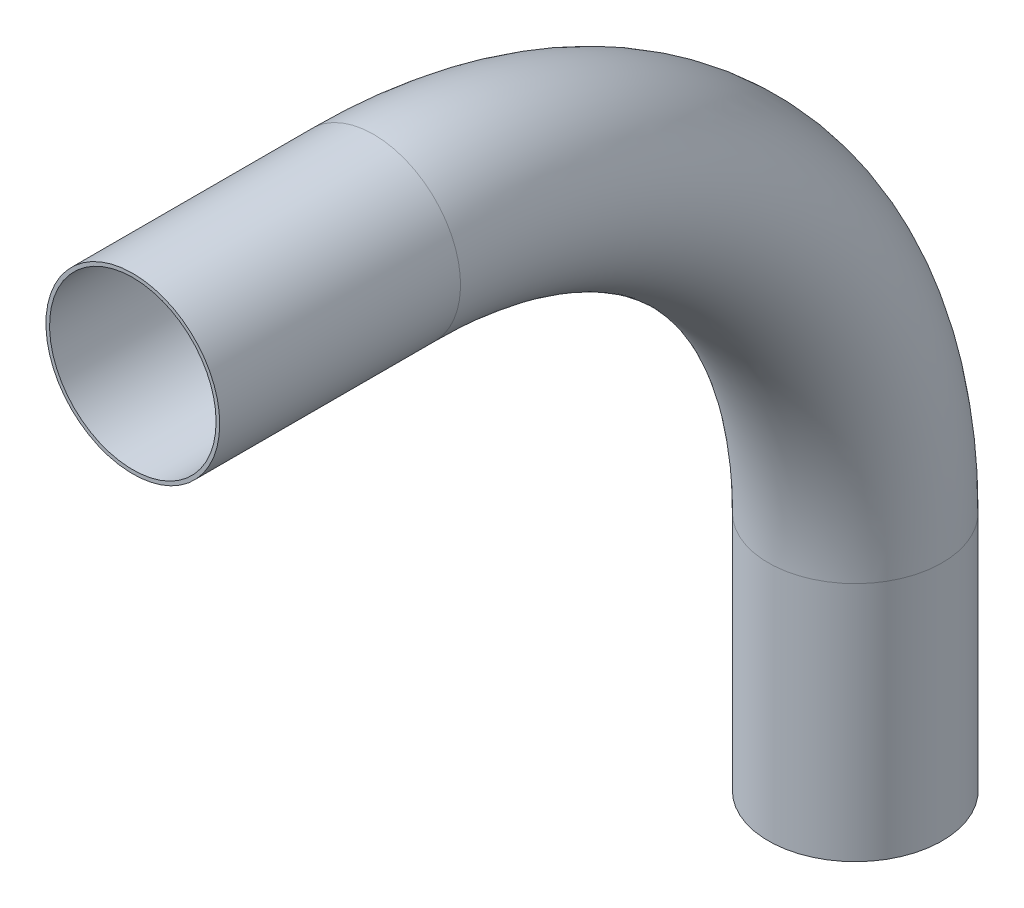
ISO-10303-21;
HEADER;
FILE_DESCRIPTION(('STEP AP214'),'2;1');
FILE_NAME('part.step','',(''),(''),'','','');
FILE_SCHEMA(('AUTOMOTIVE_DESIGN { 1 0 10303 214 1 1 1 1 }'));
ENDSEC;
DATA;
#1=APPLICATION_CONTEXT('core data for automotive mechanical design processes');
#2=APPLICATION_PROTOCOL_DEFINITION('international standard','automotive_design',2000,#1);
#3=PRODUCT_CONTEXT('',#1,'mechanical');
#4=PRODUCT('Part','Part','',(#3));
#5=PRODUCT_RELATED_PRODUCT_CATEGORY('part','',(#4));
#6=PRODUCT_DEFINITION_FORMATION('','',#4);
#7=PRODUCT_DEFINITION_CONTEXT('part definition',#1,'design');
#8=PRODUCT_DEFINITION('design','',#6,#7);
#9=PRODUCT_DEFINITION_SHAPE('','',#8);
#10=(LENGTH_UNIT() NAMED_UNIT(*) SI_UNIT(.MILLI.,.METRE.));
#11=(NAMED_UNIT(*) PLANE_ANGLE_UNIT() SI_UNIT($,.RADIAN.));
#12=(NAMED_UNIT(*) SI_UNIT($,.STERADIAN.) SOLID_ANGLE_UNIT());
#13=UNCERTAINTY_MEASURE_WITH_UNIT(LENGTH_MEASURE(1.E-05),#10,'distance_accuracy_value','');
#14=(GEOMETRIC_REPRESENTATION_CONTEXT(3) GLOBAL_UNCERTAINTY_ASSIGNED_CONTEXT((#13)) GLOBAL_UNIT_ASSIGNED_CONTEXT((#10,
#11,#12)) REPRESENTATION_CONTEXT('',''));
#15=CARTESIAN_POINT('',(0.,0.,0.));
#16=DIRECTION('',(0.,0.,1.));
#17=DIRECTION('',(1.,0.,0.));
#18=AXIS2_PLACEMENT_3D('',#15,#16,#17);
#19=CARTESIAN_POINT('',(0.,152.4,0.));
#20=DIRECTION('',(0.,-1.,0.));
#21=DIRECTION('',(0.,0.,-1.));
#22=AXIS2_PLACEMENT_3D('',#19,#20,#21);
#23=CYLINDRICAL_SURFACE('',#22,52.7);
#24=CARTESIAN_POINT('',(0.,152.4,0.));
#25=DIRECTION('',(0.,1.,0.));
#26=DIRECTION('',(0.,0.,1.));
#27=AXIS2_PLACEMENT_3D('',#24,#25,#26);
#28=CIRCLE('',#27,52.7);
#29=CARTESIAN_POINT('',(0.,152.4,-52.7));
#30=VERTEX_POINT('',#29);
#31=EDGE_CURVE('E47',#30,#30,#28,.F.);
#32=CARTESIAN_POINT('',(0.,0.,0.));
#33=DIRECTION('',(0.,1.,0.));
#34=DIRECTION('',(0.,0.,1.));
#35=AXIS2_PLACEMENT_3D('',#32,#33,#34);
#36=CIRCLE('',#35,52.7);
#37=CARTESIAN_POINT('',(0.,0.,-52.7));
#38=VERTEX_POINT('',#37);
#39=EDGE_CURVE('E42',#38,#38,#36,.T.);
#40=CARTESIAN_POINT('',(0.,152.4,-52.7));
#41=CARTESIAN_POINT('',(0.,150.8125,-52.7));
#42=CARTESIAN_POINT('',(0.,149.225,-52.7));
#43=CARTESIAN_POINT('',(0.,146.05,-52.7));
#44=CARTESIAN_POINT('',(0.,144.4625,-52.7));
#45=CARTESIAN_POINT('',(0.,141.2875,-52.7));
#46=CARTESIAN_POINT('',(0.,139.7,-52.7));
#47=CARTESIAN_POINT('',(0.,136.525,-52.7));
#48=CARTESIAN_POINT('',(0.,134.9375,-52.7));
#49=CARTESIAN_POINT('',(0.,131.7625,-52.7));
#50=CARTESIAN_POINT('',(0.,130.175,-52.7));
#51=CARTESIAN_POINT('',(0.,127.,-52.7));
#52=CARTESIAN_POINT('',(0.,125.4125,-52.7));
#53=CARTESIAN_POINT('',(0.,122.2375,-52.7));
#54=CARTESIAN_POINT('',(0.,120.65,-52.7));
#55=CARTESIAN_POINT('',(0.,117.475,-52.7));
#56=CARTESIAN_POINT('',(0.,115.8875,-52.7));
#57=CARTESIAN_POINT('',(0.,112.7125,-52.7));
#58=CARTESIAN_POINT('',(0.,111.125,-52.7));
#59=CARTESIAN_POINT('',(0.,107.95,-52.7));
#60=CARTESIAN_POINT('',(0.,106.3625,-52.7));
#61=CARTESIAN_POINT('',(0.,103.1875,-52.7));
#62=CARTESIAN_POINT('',(0.,101.6,-52.7));
#63=CARTESIAN_POINT('',(0.,98.425,-52.7));
#64=CARTESIAN_POINT('',(0.,96.8375,-52.7));
#65=CARTESIAN_POINT('',(0.,93.6625,-52.7));
#66=CARTESIAN_POINT('',(0.,92.075,-52.7));
#67=CARTESIAN_POINT('',(0.,88.9,-52.7));
#68=CARTESIAN_POINT('',(0.,87.3125,-52.7));
#69=CARTESIAN_POINT('',(0.,84.1375,-52.7));
#70=CARTESIAN_POINT('',(0.,82.55,-52.7));
#71=CARTESIAN_POINT('',(0.,79.375,-52.7));
#72=CARTESIAN_POINT('',(0.,77.7875,-52.7));
#73=CARTESIAN_POINT('',(0.,74.6125,-52.7));
#74=CARTESIAN_POINT('',(0.,73.025,-52.7));
#75=CARTESIAN_POINT('',(0.,69.85,-52.7));
#76=CARTESIAN_POINT('',(0.,68.2625,-52.7));
#77=CARTESIAN_POINT('',(0.,65.0875,-52.7));
#78=CARTESIAN_POINT('',(0.,63.5,-52.7));
#79=CARTESIAN_POINT('',(0.,60.325,-52.7));
#80=CARTESIAN_POINT('',(0.,58.7375,-52.7));
#81=CARTESIAN_POINT('',(0.,55.5625,-52.7));
#82=CARTESIAN_POINT('',(0.,53.975,-52.7));
#83=CARTESIAN_POINT('',(0.,50.8,-52.7));
#84=CARTESIAN_POINT('',(0.,49.2125,-52.7));
#85=CARTESIAN_POINT('',(0.,46.0375,-52.7));
#86=CARTESIAN_POINT('',(0.,44.45,-52.7));
#87=CARTESIAN_POINT('',(0.,41.275,-52.7));
#88=CARTESIAN_POINT('',(0.,39.6875,-52.7));
#89=CARTESIAN_POINT('',(0.,36.5125,-52.7));
#90=CARTESIAN_POINT('',(0.,34.925,-52.7));
#91=CARTESIAN_POINT('',(0.,31.75,-52.7));
#92=CARTESIAN_POINT('',(0.,30.1625,-52.7));
#93=CARTESIAN_POINT('',(0.,26.9875,-52.7));
#94=CARTESIAN_POINT('',(0.,25.4,-52.7));
#95=CARTESIAN_POINT('',(0.,22.225,-52.7));
#96=CARTESIAN_POINT('',(0.,20.6375,-52.7));
#97=CARTESIAN_POINT('',(0.,17.4625,-52.7));
#98=CARTESIAN_POINT('',(0.,15.875,-52.7));
#99=CARTESIAN_POINT('',(0.,12.7,-52.7));
#100=CARTESIAN_POINT('',(0.,11.1125,-52.7));
#101=CARTESIAN_POINT('',(0.,7.93750000000001,-52.7));
#102=CARTESIAN_POINT('',(0.,6.35,-52.7));
#103=CARTESIAN_POINT('',(0.,3.175,-52.7));
#104=CARTESIAN_POINT('',(0.,1.5875,-52.7));
#105=CARTESIAN_POINT('',(0.,0.,-52.7));
#106=B_SPLINE_CURVE_WITH_KNOTS('',3,(#40,#41,#42,#43,#44,#45,#46,#47,#48,#49,#50,#51,#52,#53,
#54,#55,#56,#57,#58,#59,#60,#61,#62,#63,#64,#65,#66,#67,#68,#69,#70,#71,#72,#73,#74,#75,#76,#77,
#78,#79,#80,#81,#82,#83,#84,#85,#86,#87,#88,#89,#90,#91,#92,#93,#94,#95,#96,#97,#98,#99,#100,
#101,#102,#103,#104,#105),.UNSPECIFIED.,.F.,.F.,(4,2,2,2,2,2,2,2,2,2,2,2,2,2,2,2,2,2,2,2,2,2,2,
2,2,2,2,2,2,2,2,2,4),(0.,4.76249999999998,9.52499999999998,14.2875,19.05,23.8125,28.575,33.3375,
38.1,42.8625,47.625,52.3875,57.15,61.9125,66.675,71.4375,76.2,80.9625,85.725,90.4875,95.25,
100.0125,104.775,109.5375,114.3,119.0625,123.825,128.5875,133.35,138.1125,142.875,147.6375,
152.4),.UNSPECIFIED.);
#107=EDGE_CURVE('BSEAM31',#30,#38,#106,.T.);
#108=ORIENTED_EDGE('',*,*,#31,.F.);
#109=ORIENTED_EDGE('',*,*,#39,.F.);
#110=ORIENTED_EDGE('',*,*,#107,.T.);
#111=ORIENTED_EDGE('',*,*,#107,.F.);
#112=EDGE_LOOP('',(#108,#110,#109,#111));
#113=FACE_BOUND('',#112,.T.);
#114=ADVANCED_FACE('F31',(#113),#23,.F.);
#115=CARTESIAN_POINT('',(0.,152.4,0.));
#116=DIRECTION('',(0.,-1.,0.));
#117=DIRECTION('',(0.,0.,-1.));
#118=AXIS2_PLACEMENT_3D('',#115,#116,#117);
#119=CYLINDRICAL_SURFACE('',#118,55.);
#120=CARTESIAN_POINT('',(0.,152.4,0.));
#121=DIRECTION('',(0.,1.,0.));
#122=DIRECTION('',(0.,0.,1.));
#123=AXIS2_PLACEMENT_3D('',#120,#121,#122);
#124=CIRCLE('',#123,55.);
#125=CARTESIAN_POINT('',(0.,152.4,-55.));
#126=VERTEX_POINT('',#125);
#127=EDGE_CURVE('E10',#126,#126,#124,.T.);
#128=CARTESIAN_POINT('',(0.,0.,0.));
#129=DIRECTION('',(0.,1.,0.));
#130=DIRECTION('',(0.,0.,1.));
#131=AXIS2_PLACEMENT_3D('',#128,#129,#130);
#132=CIRCLE('',#131,55.);
#133=CARTESIAN_POINT('',(0.,0.,-55.));
#134=VERTEX_POINT('',#133);
#135=EDGE_CURVE('E34',#134,#134,#132,.T.);
#136=CARTESIAN_POINT('',(0.,152.4,-55.));
#137=CARTESIAN_POINT('',(0.,150.8125,-55.));
#138=CARTESIAN_POINT('',(0.,149.225,-55.));
#139=CARTESIAN_POINT('',(0.,146.05,-55.));
#140=CARTESIAN_POINT('',(0.,144.4625,-55.));
#141=CARTESIAN_POINT('',(0.,141.2875,-55.));
#142=CARTESIAN_POINT('',(0.,139.7,-55.));
#143=CARTESIAN_POINT('',(0.,136.525,-55.));
#144=CARTESIAN_POINT('',(0.,134.9375,-55.));
#145=CARTESIAN_POINT('',(0.,131.7625,-55.));
#146=CARTESIAN_POINT('',(0.,130.175,-55.));
#147=CARTESIAN_POINT('',(0.,127.,-55.));
#148=CARTESIAN_POINT('',(0.,125.4125,-55.));
#149=CARTESIAN_POINT('',(0.,122.2375,-55.));
#150=CARTESIAN_POINT('',(0.,120.65,-55.));
#151=CARTESIAN_POINT('',(0.,117.475,-55.));
#152=CARTESIAN_POINT('',(0.,115.8875,-55.));
#153=CARTESIAN_POINT('',(0.,112.7125,-55.));
#154=CARTESIAN_POINT('',(0.,111.125,-55.));
#155=CARTESIAN_POINT('',(0.,107.95,-55.));
#156=CARTESIAN_POINT('',(0.,106.3625,-55.));
#157=CARTESIAN_POINT('',(0.,103.1875,-55.));
#158=CARTESIAN_POINT('',(0.,101.6,-55.));
#159=CARTESIAN_POINT('',(0.,98.425,-55.));
#160=CARTESIAN_POINT('',(0.,96.8375,-55.));
#161=CARTESIAN_POINT('',(0.,93.6625,-55.));
#162=CARTESIAN_POINT('',(0.,92.075,-55.));
#163=CARTESIAN_POINT('',(0.,88.9,-55.));
#164=CARTESIAN_POINT('',(0.,87.3125,-55.));
#165=CARTESIAN_POINT('',(0.,84.1375,-55.));
#166=CARTESIAN_POINT('',(0.,82.55,-55.));
#167=CARTESIAN_POINT('',(0.,79.375,-55.));
#168=CARTESIAN_POINT('',(0.,77.7875,-55.));
#169=CARTESIAN_POINT('',(0.,74.6125,-55.));
#170=CARTESIAN_POINT('',(0.,73.025,-55.));
#171=CARTESIAN_POINT('',(0.,69.85,-55.));
#172=CARTESIAN_POINT('',(0.,68.2625,-55.));
#173=CARTESIAN_POINT('',(0.,65.0875,-55.));
#174=CARTESIAN_POINT('',(0.,63.5,-55.));
#175=CARTESIAN_POINT('',(0.,60.325,-55.));
#176=CARTESIAN_POINT('',(0.,58.7375,-55.));
#177=CARTESIAN_POINT('',(0.,55.5625,-55.));
#178=CARTESIAN_POINT('',(0.,53.975,-55.));
#179=CARTESIAN_POINT('',(0.,50.8,-55.));
#180=CARTESIAN_POINT('',(0.,49.2125,-55.));
#181=CARTESIAN_POINT('',(0.,46.0375,-55.));
#182=CARTESIAN_POINT('',(0.,44.45,-55.));
#183=CARTESIAN_POINT('',(0.,41.275,-55.));
#184=CARTESIAN_POINT('',(0.,39.6875,-55.));
#185=CARTESIAN_POINT('',(0.,36.5125,-55.));
#186=CARTESIAN_POINT('',(0.,34.925,-55.));
#187=CARTESIAN_POINT('',(0.,31.75,-55.));
#188=CARTESIAN_POINT('',(0.,30.1625,-55.));
#189=CARTESIAN_POINT('',(0.,26.9875,-55.));
#190=CARTESIAN_POINT('',(0.,25.4,-55.));
#191=CARTESIAN_POINT('',(0.,22.225,-55.));
#192=CARTESIAN_POINT('',(0.,20.6375,-55.));
#193=CARTESIAN_POINT('',(0.,17.4625,-55.));
#194=CARTESIAN_POINT('',(0.,15.875,-55.));
#195=CARTESIAN_POINT('',(0.,12.7,-55.));
#196=CARTESIAN_POINT('',(0.,11.1125,-55.));
#197=CARTESIAN_POINT('',(0.,7.93750000000001,-55.));
#198=CARTESIAN_POINT('',(0.,6.35,-55.));
#199=CARTESIAN_POINT('',(0.,3.175,-55.));
#200=CARTESIAN_POINT('',(0.,1.5875,-55.));
#201=CARTESIAN_POINT('',(0.,0.,-55.));
#202=B_SPLINE_CURVE_WITH_KNOTS('',3,(#136,#137,#138,#139,#140,#141,#142,#143,#144,#145,#146,
#147,#148,#149,#150,#151,#152,#153,#154,#155,#156,#157,#158,#159,#160,#161,#162,#163,#164,#165,
#166,#167,#168,#169,#170,#171,#172,#173,#174,#175,#176,#177,#178,#179,#180,#181,#182,#183,#184,
#185,#186,#187,#188,#189,#190,#191,#192,#193,#194,#195,#196,#197,#198,#199,#200,#201),
.UNSPECIFIED.,.F.,.F.,(4,2,2,2,2,2,2,2,2,2,2,2,2,2,2,2,2,2,2,2,2,2,2,2,2,2,2,2,2,2,2,2,4),(0.,
4.76249999999998,9.52499999999998,14.2875,19.05,23.8125,28.575,33.3375,38.1,42.8625,47.625,
52.3875,57.15,61.9125,66.675,71.4375,76.2,80.9625,85.725,90.4875,95.25,100.0125,104.775,
109.5375,114.3,119.0625,123.825,128.5875,133.35,138.1125,142.875,147.6375,152.4),.UNSPECIFIED.);
#203=EDGE_CURVE('BSEAM90',#126,#134,#202,.T.);
#204=ORIENTED_EDGE('',*,*,#127,.F.);
#205=ORIENTED_EDGE('',*,*,#135,.T.);
#206=ORIENTED_EDGE('',*,*,#203,.T.);
#207=ORIENTED_EDGE('',*,*,#203,.F.);
#208=EDGE_LOOP('',(#204,#206,#205,#207));
#209=FACE_BOUND('',#208,.T.);
#210=ADVANCED_FACE('F90',(#209),#119,.T.);
#211=CARTESIAN_POINT('',(0.,0.,0.));
#212=DIRECTION('',(0.,1.,0.));
#213=DIRECTION('',(0.,0.,1.));
#214=AXIS2_PLACEMENT_3D('',#211,#212,#213);
#215=PLANE('',#214);
#216=ORIENTED_EDGE('',*,*,#39,.T.);
#217=EDGE_LOOP('',(#216));
#218=FACE_BOUND('',#217,.T.);
#219=ORIENTED_EDGE('',*,*,#135,.F.);
#220=EDGE_LOOP('',(#219));
#221=FACE_BOUND('',#220,.T.);
#222=ADVANCED_FACE('F83',(#218,#221),#215,.F.);
#223=CARTESIAN_POINT('',(0.,152.4,304.8));
#224=DIRECTION('',(-1.,0.,0.));
#225=DIRECTION('',(0.,0.,1.));
#226=AXIS2_PLACEMENT_3D('',#223,#224,#225);
#227=TOROIDAL_SURFACE('',#226,304.8,55.);
#228=CARTESIAN_POINT('',(0.,457.2,304.8));
#229=DIRECTION('',(0.,0.,1.));
#230=DIRECTION('',(0.,-1.,0.));
#231=AXIS2_PLACEMENT_3D('',#228,#229,#230);
#232=CIRCLE('',#231,55.);
#233=CARTESIAN_POINT('',(0.,512.2,304.8));
#234=VERTEX_POINT('',#233);
#235=EDGE_CURVE('E44',#234,#234,#232,.T.);
#236=CARTESIAN_POINT('',(0.,152.4,304.8));
#237=DIRECTION('',(-1.,0.,0.));
#238=DIRECTION('',(0.,0.,1.));
#239=AXIS2_PLACEMENT_3D('',#236,#237,#238);
#240=CIRCLE('',#239,359.8);
#241=EDGE_CURVE('',#234,#126,#240,.T.);
#242=ORIENTED_EDGE('',*,*,#235,.F.);
#243=ORIENTED_EDGE('',*,*,#127,.T.);
#244=ORIENTED_EDGE('',*,*,#241,.T.);
#245=ORIENTED_EDGE('',*,*,#241,.F.);
#246=EDGE_LOOP('',(#242,#244,#243,#245));
#247=FACE_BOUND('',#246,.T.);
#248=ADVANCED_FACE('F80',(#247),#227,.T.);
#249=CARTESIAN_POINT('',(0.,152.4,304.8));
#250=DIRECTION('',(-1.,0.,0.));
#251=DIRECTION('',(0.,0.,1.));
#252=AXIS2_PLACEMENT_3D('',#249,#250,#251);
#253=TOROIDAL_SURFACE('',#252,304.8,52.7);
#254=CARTESIAN_POINT('',(0.,457.2,304.8));
#255=DIRECTION('',(0.,0.,1.));
#256=DIRECTION('',(0.,-1.,0.));
#257=AXIS2_PLACEMENT_3D('',#254,#255,#256);
#258=CIRCLE('',#257,52.7);
#259=CARTESIAN_POINT('',(0.,509.9,304.8));
#260=VERTEX_POINT('',#259);
#261=EDGE_CURVE('E51',#260,#260,#258,.F.);
#262=CARTESIAN_POINT('',(0.,152.4,304.8));
#263=DIRECTION('',(-1.,0.,0.));
#264=DIRECTION('',(0.,0.,1.));
#265=AXIS2_PLACEMENT_3D('',#262,#263,#264);
#266=CIRCLE('',#265,357.5);
#267=EDGE_CURVE('',#260,#30,#266,.T.);
#268=ORIENTED_EDGE('',*,*,#261,.F.);
#269=ORIENTED_EDGE('',*,*,#31,.T.);
#270=ORIENTED_EDGE('',*,*,#267,.T.);
#271=ORIENTED_EDGE('',*,*,#267,.F.);
#272=EDGE_LOOP('',(#268,#270,#269,#271));
#273=FACE_BOUND('',#272,.T.);
#274=ADVANCED_FACE('F82',(#273),#253,.F.);
#275=CARTESIAN_POINT('',(0.,457.2,457.2));
#276=DIRECTION('',(0.,0.,-1.));
#277=DIRECTION('',(-1.,0.,0.));
#278=AXIS2_PLACEMENT_3D('',#275,#276,#277);
#279=CYLINDRICAL_SURFACE('',#278,52.7);
#280=CARTESIAN_POINT('',(0.,457.2,457.2));
#281=DIRECTION('',(0.,0.,1.));
#282=DIRECTION('',(1.,0.,0.));
#283=AXIS2_PLACEMENT_3D('',#280,#281,#282);
#284=CIRCLE('',#283,52.7);
#285=CARTESIAN_POINT('',(52.7,457.2,457.2));
#286=VERTEX_POINT('',#285);
#287=EDGE_CURVE('E60',#286,#286,#284,.T.);
#288=ORIENTED_EDGE('',*,*,#287,.T.);
#289=EDGE_LOOP('',(#288));
#290=FACE_BOUND('',#289,.T.);
#291=ORIENTED_EDGE('',*,*,#261,.T.);
#292=EDGE_LOOP('',(#291));
#293=FACE_BOUND('',#292,.T.);
#294=ADVANCED_FACE('F64',(#290,#293),#279,.F.);
#295=CARTESIAN_POINT('',(0.,457.2,457.2));
#296=DIRECTION('',(0.,0.,-1.));
#297=DIRECTION('',(-1.,0.,0.));
#298=AXIS2_PLACEMENT_3D('',#295,#296,#297);
#299=CYLINDRICAL_SURFACE('',#298,55.);
#300=CARTESIAN_POINT('',(0.,457.2,457.2));
#301=DIRECTION('',(0.,0.,1.));
#302=DIRECTION('',(1.,0.,0.));
#303=AXIS2_PLACEMENT_3D('',#300,#301,#302);
#304=CIRCLE('',#303,55.);
#305=CARTESIAN_POINT('',(55.,457.2,457.2));
#306=VERTEX_POINT('',#305);
#307=EDGE_CURVE('E57',#306,#306,#304,.T.);
#308=ORIENTED_EDGE('',*,*,#307,.F.);
#309=EDGE_LOOP('',(#308));
#310=FACE_BOUND('',#309,.T.);
#311=ORIENTED_EDGE('',*,*,#235,.T.);
#312=EDGE_LOOP('',(#311));
#313=FACE_BOUND('',#312,.T.);
#314=ADVANCED_FACE('F70',(#310,#313),#299,.T.);
#315=CARTESIAN_POINT('',(0.,0.,457.2));
#316=DIRECTION('',(0.,0.,1.));
#317=DIRECTION('',(1.,0.,0.));
#318=AXIS2_PLACEMENT_3D('',#315,#316,#317);
#319=PLANE('',#318);
#320=ORIENTED_EDGE('',*,*,#287,.F.);
#321=EDGE_LOOP('',(#320));
#322=FACE_BOUND('',#321,.T.);
#323=ORIENTED_EDGE('',*,*,#307,.T.);
#324=EDGE_LOOP('',(#323));
#325=FACE_BOUND('',#324,.T.);
#326=ADVANCED_FACE('F67',(#322,#325),#319,.T.);
#327=CLOSED_SHELL('',(#114,#210,#222,#248,#274,#294,#314,#326));
#328=MANIFOLD_SOLID_BREP('B2',#327);
#329=ADVANCED_BREP_SHAPE_REPRESENTATION('',(#18,#328),#14);
#330=SHAPE_DEFINITION_REPRESENTATION(#9,#329);
ENDSEC;
END-ISO-10303-21;
